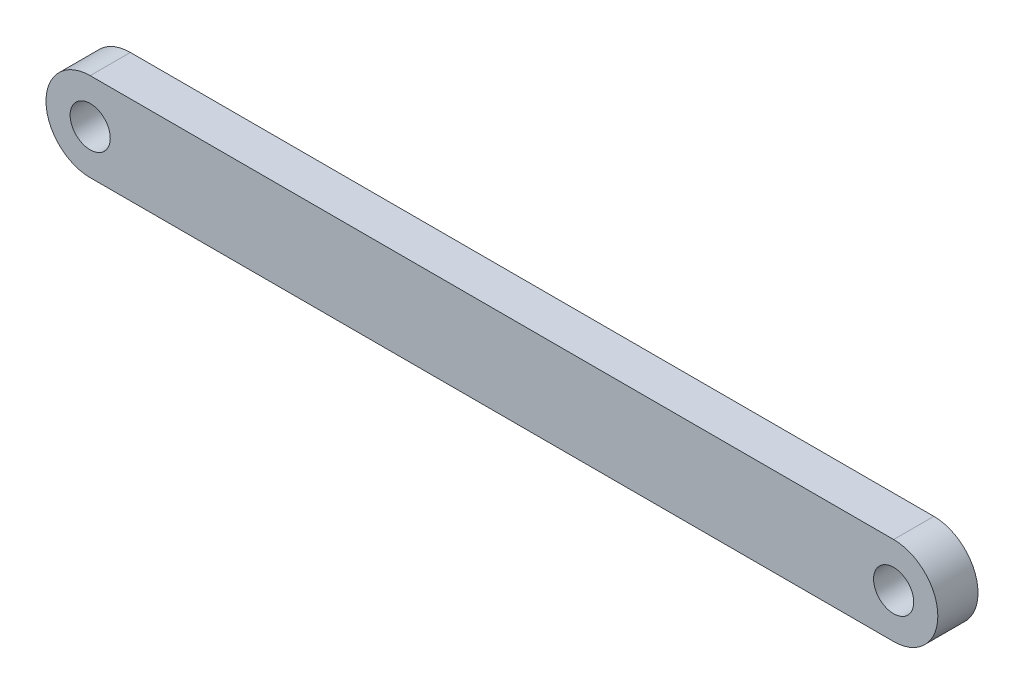
ISO-10303-21;
HEADER;
FILE_DESCRIPTION(('STEP AP214'),'2;1');
FILE_NAME('part.step','',(''),(''),'','','');
FILE_SCHEMA(('AUTOMOTIVE_DESIGN { 1 0 10303 214 1 1 1 1 }'));
ENDSEC;
DATA;
#1=APPLICATION_CONTEXT('core data for automotive mechanical design processes');
#2=APPLICATION_PROTOCOL_DEFINITION('international standard','automotive_design',2000,#1);
#3=PRODUCT_CONTEXT('',#1,'mechanical');
#4=PRODUCT('Part','Part','',(#3));
#5=PRODUCT_RELATED_PRODUCT_CATEGORY('part','',(#4));
#6=PRODUCT_DEFINITION_FORMATION('','',#4);
#7=PRODUCT_DEFINITION_CONTEXT('part definition',#1,'design');
#8=PRODUCT_DEFINITION('design','',#6,#7);
#9=PRODUCT_DEFINITION_SHAPE('','',#8);
#10=(LENGTH_UNIT() NAMED_UNIT(*) SI_UNIT(.MILLI.,.METRE.));
#11=(NAMED_UNIT(*) PLANE_ANGLE_UNIT() SI_UNIT($,.RADIAN.));
#12=(NAMED_UNIT(*) SI_UNIT($,.STERADIAN.) SOLID_ANGLE_UNIT());
#13=UNCERTAINTY_MEASURE_WITH_UNIT(LENGTH_MEASURE(1.E-05),#10,'distance_accuracy_value','');
#14=(GEOMETRIC_REPRESENTATION_CONTEXT(3) GLOBAL_UNCERTAINTY_ASSIGNED_CONTEXT((#13)) GLOBAL_UNIT_ASSIGNED_CONTEXT((#10,
#11,#12)) REPRESENTATION_CONTEXT('',''));
#15=CARTESIAN_POINT('',(0.,0.,0.));
#16=DIRECTION('',(0.,0.,1.));
#17=DIRECTION('',(1.,0.,0.));
#18=AXIS2_PLACEMENT_3D('',#15,#16,#17);
#19=CARTESIAN_POINT('',(254.,0.,15.875));
#20=DIRECTION('',(0.,0.,-1.));
#21=DIRECTION('',(-1.,0.,0.));
#22=AXIS2_PLACEMENT_3D('',#19,#20,#21);
#23=CYLINDRICAL_SURFACE('',#22,27.94);
#24=CARTESIAN_POINT('',(254.,0.,-9.525));
#25=DIRECTION('',(0.,0.,1.));
#26=DIRECTION('',(-1.,0.,0.));
#27=AXIS2_PLACEMENT_3D('',#24,#25,#26);
#28=CIRCLE('',#27,27.94);
#29=CARTESIAN_POINT('',(254.,-27.94,-9.525));
#30=VERTEX_POINT('',#29);
#31=CARTESIAN_POINT('',(254.,27.94,-9.525));
#32=VERTEX_POINT('',#31);
#33=EDGE_CURVE('E101',#30,#32,#28,.T.);
#34=ORIENTED_EDGE('',*,*,#33,.T.);
#35=DIRECTION('',(0.,0.,-1.));
#36=VECTOR('',#35,1.);
#37=CARTESIAN_POINT('',(254.,27.94,15.875));
#38=LINE('',#37,#36);
#39=CARTESIAN_POINT('',(254.,27.94,15.875));
#40=VERTEX_POINT('',#39);
#41=EDGE_CURVE('E11',#40,#32,#38,.T.);
#42=ORIENTED_EDGE('',*,*,#41,.F.);
#43=CARTESIAN_POINT('',(254.,0.,15.875));
#44=DIRECTION('',(0.,0.,1.));
#45=DIRECTION('',(-1.,0.,0.));
#46=AXIS2_PLACEMENT_3D('',#43,#44,#45);
#47=CIRCLE('',#46,27.94);
#48=CARTESIAN_POINT('',(254.,-27.94,15.875));
#49=VERTEX_POINT('',#48);
#50=EDGE_CURVE('E89',#49,#40,#47,.T.);
#51=ORIENTED_EDGE('',*,*,#50,.F.);
#52=DIRECTION('',(0.,0.,-1.));
#53=VECTOR('',#52,1.);
#54=CARTESIAN_POINT('',(254.,-27.94,15.875));
#55=LINE('',#54,#53);
#56=EDGE_CURVE('E97',#49,#30,#55,.T.);
#57=ORIENTED_EDGE('',*,*,#56,.T.);
#58=EDGE_LOOP('',(#34,#42,#51,#57));
#59=FACE_BOUND('',#58,.T.);
#60=ADVANCED_FACE('F38',(#59),#23,.T.);
#61=CARTESIAN_POINT('',(-254.,27.94,15.875));
#62=DIRECTION('',(0.,-1.,0.));
#63=DIRECTION('',(0.,0.,-1.));
#64=AXIS2_PLACEMENT_3D('',#61,#62,#63);
#65=PLANE('',#64);
#66=DIRECTION('',(-1.,0.,0.));
#67=VECTOR('',#66,1.);
#68=CARTESIAN_POINT('',(-254.,27.94,-9.525));
#69=LINE('',#68,#67);
#70=CARTESIAN_POINT('',(-254.,27.94,-9.525));
#71=VERTEX_POINT('',#70);
#72=EDGE_CURVE('E93',#32,#71,#69,.T.);
#73=ORIENTED_EDGE('',*,*,#72,.T.);
#74=DIRECTION('',(0.,0.,-1.));
#75=VECTOR('',#74,1.);
#76=CARTESIAN_POINT('',(-254.,27.94,15.875));
#77=LINE('',#76,#75);
#78=CARTESIAN_POINT('',(-254.,27.94,15.875));
#79=VERTEX_POINT('',#78);
#80=EDGE_CURVE('E46',#79,#71,#77,.T.);
#81=ORIENTED_EDGE('',*,*,#80,.F.);
#82=DIRECTION('',(-1.,0.,0.));
#83=VECTOR('',#82,1.);
#84=CARTESIAN_POINT('',(-254.,27.94,15.875));
#85=LINE('',#84,#83);
#86=EDGE_CURVE('E84',#40,#79,#85,.T.);
#87=ORIENTED_EDGE('',*,*,#86,.F.);
#88=ORIENTED_EDGE('',*,*,#41,.T.);
#89=EDGE_LOOP('',(#73,#81,#87,#88));
#90=FACE_BOUND('',#89,.T.);
#91=ADVANCED_FACE('F92',(#90),#65,.F.);
#92=CARTESIAN_POINT('',(-254.,0.,15.875));
#93=DIRECTION('',(0.,0.,-1.));
#94=DIRECTION('',(-1.,0.,0.));
#95=AXIS2_PLACEMENT_3D('',#92,#93,#94);
#96=CYLINDRICAL_SURFACE('',#95,27.94);
#97=CARTESIAN_POINT('',(-254.,0.,-9.525));
#98=DIRECTION('',(0.,0.,1.));
#99=DIRECTION('',(1.,0.,0.));
#100=AXIS2_PLACEMENT_3D('',#97,#98,#99);
#101=CIRCLE('',#100,27.94);
#102=CARTESIAN_POINT('',(-254.,-27.94,-9.525));
#103=VERTEX_POINT('',#102);
#104=EDGE_CURVE('E71',#71,#103,#101,.T.);
#105=ORIENTED_EDGE('',*,*,#104,.T.);
#106=DIRECTION('',(0.,0.,-1.));
#107=VECTOR('',#106,1.);
#108=CARTESIAN_POINT('',(-254.,-27.94,15.875));
#109=LINE('',#108,#107);
#110=CARTESIAN_POINT('',(-254.,-27.94,15.875));
#111=VERTEX_POINT('',#110);
#112=EDGE_CURVE('E94',#111,#103,#109,.T.);
#113=ORIENTED_EDGE('',*,*,#112,.F.);
#114=CARTESIAN_POINT('',(-254.,0.,15.875));
#115=DIRECTION('',(0.,0.,1.));
#116=DIRECTION('',(1.,0.,0.));
#117=AXIS2_PLACEMENT_3D('',#114,#115,#116);
#118=CIRCLE('',#117,27.94);
#119=EDGE_CURVE('E87',#79,#111,#118,.T.);
#120=ORIENTED_EDGE('',*,*,#119,.F.);
#121=ORIENTED_EDGE('',*,*,#80,.T.);
#122=EDGE_LOOP('',(#105,#113,#120,#121));
#123=FACE_BOUND('',#122,.T.);
#124=ADVANCED_FACE('F95',(#123),#96,.T.);
#125=CARTESIAN_POINT('',(-254.,-27.94,15.875));
#126=DIRECTION('',(0.,1.,0.));
#127=DIRECTION('',(0.,0.,1.));
#128=AXIS2_PLACEMENT_3D('',#125,#126,#127);
#129=PLANE('',#128);
#130=DIRECTION('',(1.,0.,0.));
#131=VECTOR('',#130,1.);
#132=CARTESIAN_POINT('',(-254.,-27.94,-9.525));
#133=LINE('',#132,#131);
#134=EDGE_CURVE('E77',#103,#30,#133,.T.);
#135=ORIENTED_EDGE('',*,*,#134,.T.);
#136=ORIENTED_EDGE('',*,*,#56,.F.);
#137=DIRECTION('',(1.,0.,0.));
#138=VECTOR('',#137,1.);
#139=CARTESIAN_POINT('',(-254.,-27.94,15.875));
#140=LINE('',#139,#138);
#141=EDGE_CURVE('E54',#111,#49,#140,.T.);
#142=ORIENTED_EDGE('',*,*,#141,.F.);
#143=ORIENTED_EDGE('',*,*,#112,.T.);
#144=EDGE_LOOP('',(#135,#136,#142,#143));
#145=FACE_BOUND('',#144,.T.);
#146=ADVANCED_FACE('F109',(#145),#129,.F.);
#147=CARTESIAN_POINT('',(254.,0.,15.875));
#148=DIRECTION('',(0.,0.,-1.));
#149=DIRECTION('',(-1.,0.,0.));
#150=AXIS2_PLACEMENT_3D('',#147,#148,#149);
#151=PLANE('',#150);
#152=CARTESIAN_POINT('',(254.,0.,15.875));
#153=DIRECTION('',(0.,0.,1.));
#154=DIRECTION('',(1.,0.,0.));
#155=AXIS2_PLACEMENT_3D('',#152,#153,#154);
#156=CIRCLE('',#155,12.7);
#157=CARTESIAN_POINT('',(266.7,0.,15.875));
#158=VERTEX_POINT('',#157);
#159=EDGE_CURVE('E121',#158,#158,#156,.T.);
#160=ORIENTED_EDGE('',*,*,#159,.F.);
#161=EDGE_LOOP('',(#160));
#162=FACE_BOUND('',#161,.T.);
#163=CARTESIAN_POINT('',(-254.,0.,15.875));
#164=DIRECTION('',(0.,0.,1.));
#165=DIRECTION('',(1.,0.,0.));
#166=AXIS2_PLACEMENT_3D('',#163,#164,#165);
#167=CIRCLE('',#166,12.7);
#168=CARTESIAN_POINT('',(-241.3,0.,15.875));
#169=VERTEX_POINT('',#168);
#170=EDGE_CURVE('E118',#169,#169,#167,.T.);
#171=ORIENTED_EDGE('',*,*,#170,.F.);
#172=EDGE_LOOP('',(#171));
#173=FACE_BOUND('',#172,.T.);
#174=ORIENTED_EDGE('',*,*,#50,.T.);
#175=ORIENTED_EDGE('',*,*,#86,.T.);
#176=ORIENTED_EDGE('',*,*,#119,.T.);
#177=ORIENTED_EDGE('',*,*,#141,.T.);
#178=EDGE_LOOP('',(#174,#175,#176,#177));
#179=FACE_BOUND('',#178,.T.);
#180=ADVANCED_FACE('F85',(#162,#173,#179),#151,.F.);
#181=CARTESIAN_POINT('',(254.,0.,-9.525));
#182=DIRECTION('',(0.,0.,-1.));
#183=DIRECTION('',(-1.,0.,0.));
#184=AXIS2_PLACEMENT_3D('',#181,#182,#183);
#185=PLANE('',#184);
#186=CARTESIAN_POINT('',(254.,0.,-9.525));
#187=DIRECTION('',(0.,0.,1.));
#188=DIRECTION('',(1.,0.,0.));
#189=AXIS2_PLACEMENT_3D('',#186,#187,#188);
#190=CIRCLE('',#189,12.7);
#191=CARTESIAN_POINT('',(266.7,0.,-9.525));
#192=VERTEX_POINT('',#191);
#193=EDGE_CURVE('E104',#192,#192,#190,.T.);
#194=ORIENTED_EDGE('',*,*,#193,.T.);
#195=EDGE_LOOP('',(#194));
#196=FACE_BOUND('',#195,.T.);
#197=CARTESIAN_POINT('',(-254.,0.,-9.525));
#198=DIRECTION('',(0.,0.,1.));
#199=DIRECTION('',(1.,0.,0.));
#200=AXIS2_PLACEMENT_3D('',#197,#198,#199);
#201=CIRCLE('',#200,12.7);
#202=CARTESIAN_POINT('',(-241.3,0.,-9.525));
#203=VERTEX_POINT('',#202);
#204=EDGE_CURVE('E115',#203,#203,#201,.T.);
#205=ORIENTED_EDGE('',*,*,#204,.T.);
#206=EDGE_LOOP('',(#205));
#207=FACE_BOUND('',#206,.T.);
#208=ORIENTED_EDGE('',*,*,#33,.F.);
#209=ORIENTED_EDGE('',*,*,#134,.F.);
#210=ORIENTED_EDGE('',*,*,#104,.F.);
#211=ORIENTED_EDGE('',*,*,#72,.F.);
#212=EDGE_LOOP('',(#208,#209,#210,#211));
#213=FACE_BOUND('',#212,.T.);
#214=ADVANCED_FACE('F112',(#196,#207,#213),#185,.T.);
#215=CARTESIAN_POINT('',(-254.,0.,-9.525));
#216=DIRECTION('',(0.,0.,1.));
#217=DIRECTION('',(1.,0.,0.));
#218=AXIS2_PLACEMENT_3D('',#215,#216,#217);
#219=CYLINDRICAL_SURFACE('',#218,12.7);
#220=ORIENTED_EDGE('',*,*,#204,.F.);
#221=EDGE_LOOP('',(#220));
#222=FACE_BOUND('',#221,.T.);
#223=ORIENTED_EDGE('',*,*,#170,.T.);
#224=EDGE_LOOP('',(#223));
#225=FACE_BOUND('',#224,.T.);
#226=ADVANCED_FACE('F132',(#222,#225),#219,.F.);
#227=CARTESIAN_POINT('',(254.,0.,-9.525));
#228=DIRECTION('',(0.,0.,1.));
#229=DIRECTION('',(1.,0.,0.));
#230=AXIS2_PLACEMENT_3D('',#227,#228,#229);
#231=CYLINDRICAL_SURFACE('',#230,12.7);
#232=ORIENTED_EDGE('',*,*,#193,.F.);
#233=EDGE_LOOP('',(#232));
#234=FACE_BOUND('',#233,.T.);
#235=ORIENTED_EDGE('',*,*,#159,.T.);
#236=EDGE_LOOP('',(#235));
#237=FACE_BOUND('',#236,.T.);
#238=ADVANCED_FACE('F129',(#234,#237),#231,.F.);
#239=CLOSED_SHELL('',(#60,#91,#124,#146,#180,#214,#226,#238));
#240=MANIFOLD_SOLID_BREP('B2',#239);
#241=ADVANCED_BREP_SHAPE_REPRESENTATION('',(#18,#240),#14);
#242=SHAPE_DEFINITION_REPRESENTATION(#9,#241);
ENDSEC;
END-ISO-10303-21;
